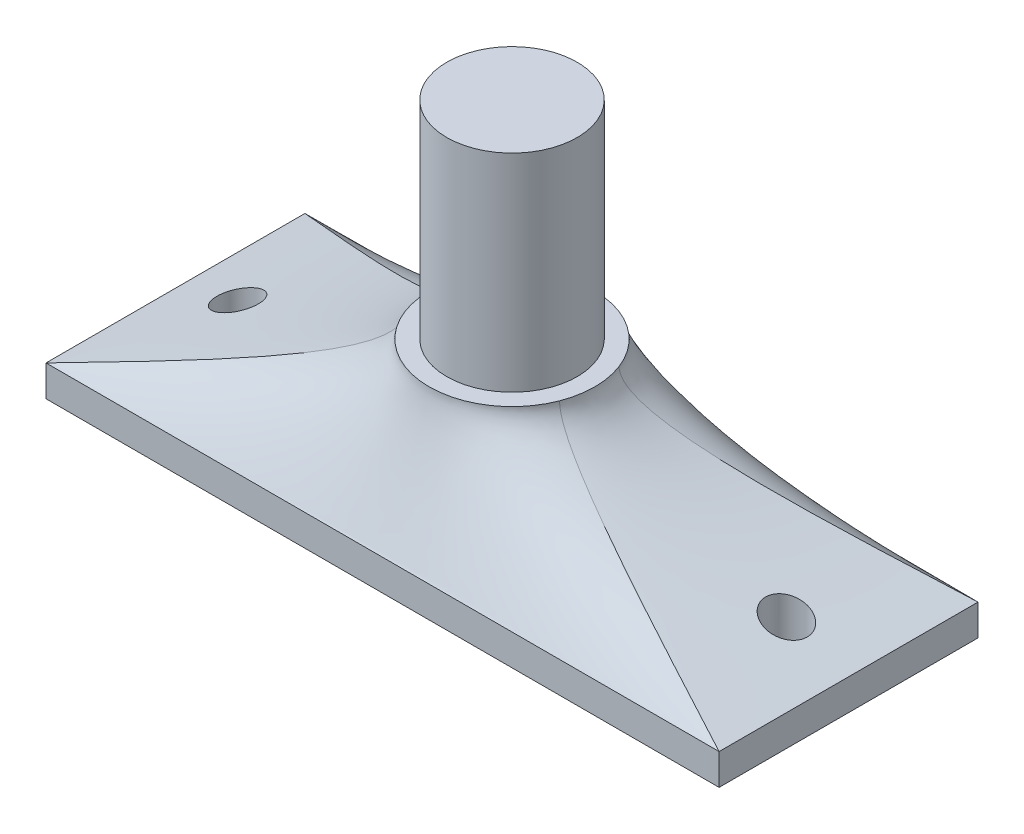
ISO-10303-21;
HEADER;
FILE_DESCRIPTION(('STEP AP214'),'2;1');
FILE_NAME('part.step','',(''),(''),'','','');
FILE_SCHEMA(('AUTOMOTIVE_DESIGN { 1 0 10303 214 1 1 1 1 }'));
ENDSEC;
DATA;
#1=APPLICATION_CONTEXT('core data for automotive mechanical design processes');
#2=APPLICATION_PROTOCOL_DEFINITION('international standard','automotive_design',2000,#1);
#3=PRODUCT_CONTEXT('',#1,'mechanical');
#4=PRODUCT('Part','Part','',(#3));
#5=PRODUCT_RELATED_PRODUCT_CATEGORY('part','',(#4));
#6=PRODUCT_DEFINITION_FORMATION('','',#4);
#7=PRODUCT_DEFINITION_CONTEXT('part definition',#1,'design');
#8=PRODUCT_DEFINITION('design','',#6,#7);
#9=PRODUCT_DEFINITION_SHAPE('','',#8);
#10=(LENGTH_UNIT() NAMED_UNIT(*) SI_UNIT(.MILLI.,.METRE.));
#11=(NAMED_UNIT(*) PLANE_ANGLE_UNIT() SI_UNIT($,.RADIAN.));
#12=(NAMED_UNIT(*) SI_UNIT($,.STERADIAN.) SOLID_ANGLE_UNIT());
#13=UNCERTAINTY_MEASURE_WITH_UNIT(LENGTH_MEASURE(1.E-05),#10,'distance_accuracy_value','');
#14=(GEOMETRIC_REPRESENTATION_CONTEXT(3) GLOBAL_UNCERTAINTY_ASSIGNED_CONTEXT((#13)) GLOBAL_UNIT_ASSIGNED_CONTEXT((#10,
#11,#12)) REPRESENTATION_CONTEXT('',''));
#15=CARTESIAN_POINT('',(0.,0.,0.));
#16=DIRECTION('',(0.,0.,1.));
#17=DIRECTION('',(1.,0.,0.));
#18=AXIS2_PLACEMENT_3D('',#15,#16,#17);
#19=CARTESIAN_POINT('',(-32.5,3.,-12.5));
#20=DIRECTION('',(1.,0.,0.));
#21=DIRECTION('',(0.,0.,-1.));
#22=AXIS2_PLACEMENT_3D('',#19,#20,#21);
#23=PLANE('',#22);
#24=DIRECTION('',(0.,0.,1.));
#25=VECTOR('',#24,1.);
#26=CARTESIAN_POINT('',(-32.5,0.,-12.5));
#27=LINE('',#26,#25);
#28=CARTESIAN_POINT('',(-32.5,0.,-12.5));
#29=VERTEX_POINT('',#28);
#30=CARTESIAN_POINT('',(-32.5,0.,12.5));
#31=VERTEX_POINT('',#30);
#32=EDGE_CURVE('E170',#29,#31,#27,.T.);
#33=ORIENTED_EDGE('',*,*,#32,.T.);
#34=DIRECTION('',(0.,-1.,0.));
#35=VECTOR('',#34,1.);
#36=CARTESIAN_POINT('',(-32.5,3.,12.5));
#37=LINE('',#36,#35);
#38=CARTESIAN_POINT('',(-32.5,3.,12.5));
#39=VERTEX_POINT('',#38);
#40=EDGE_CURVE('E116',#39,#31,#37,.T.);
#41=ORIENTED_EDGE('',*,*,#40,.F.);
#42=DIRECTION('',(0.,0.,-1.));
#43=VECTOR('',#42,1.);
#44=CARTESIAN_POINT('',(-32.5,3.,-12.5));
#45=LINE('',#44,#43);
#46=CARTESIAN_POINT('',(-32.5,3.,-12.5));
#47=VERTEX_POINT('',#46);
#48=EDGE_CURVE('E336',#47,#39,#45,.F.);
#49=ORIENTED_EDGE('',*,*,#48,.F.);
#50=DIRECTION('',(0.,-1.,0.));
#51=VECTOR('',#50,1.);
#52=CARTESIAN_POINT('',(-32.5,3.,-12.5));
#53=LINE('',#52,#51);
#54=EDGE_CURVE('E124',#47,#29,#53,.T.);
#55=ORIENTED_EDGE('',*,*,#54,.T.);
#56=EDGE_LOOP('',(#33,#41,#49,#55));
#57=FACE_BOUND('',#56,.T.);
#58=ADVANCED_FACE('F103',(#57),#23,.F.);
#59=CARTESIAN_POINT('',(-32.5,3.,12.5));
#60=DIRECTION('',(0.,0.,-1.));
#61=DIRECTION('',(-1.,0.,0.));
#62=AXIS2_PLACEMENT_3D('',#59,#60,#61);
#63=PLANE('',#62);
#64=DIRECTION('',(1.,0.,0.));
#65=VECTOR('',#64,1.);
#66=CARTESIAN_POINT('',(-32.5,0.,12.5));
#67=LINE('',#66,#65);
#68=CARTESIAN_POINT('',(32.5,0.,12.5));
#69=VERTEX_POINT('',#68);
#70=EDGE_CURVE('E323',#31,#69,#67,.T.);
#71=ORIENTED_EDGE('',*,*,#70,.T.);
#72=DIRECTION('',(0.,-1.,0.));
#73=VECTOR('',#72,1.);
#74=CARTESIAN_POINT('',(32.5,3.,12.5));
#75=LINE('',#74,#73);
#76=CARTESIAN_POINT('',(32.5,3.,12.5));
#77=VERTEX_POINT('',#76);
#78=EDGE_CURVE('E325',#77,#69,#75,.T.);
#79=ORIENTED_EDGE('',*,*,#78,.F.);
#80=DIRECTION('',(-1.,0.,0.));
#81=VECTOR('',#80,1.);
#82=CARTESIAN_POINT('',(-32.5,3.,12.5));
#83=LINE('',#82,#81);
#84=EDGE_CURVE('E167',#39,#77,#83,.F.);
#85=ORIENTED_EDGE('',*,*,#84,.F.);
#86=ORIENTED_EDGE('',*,*,#40,.T.);
#87=EDGE_LOOP('',(#71,#79,#85,#86));
#88=FACE_BOUND('',#87,.T.);
#89=ADVANCED_FACE('F313',(#88),#63,.F.);
#90=CARTESIAN_POINT('',(32.5,3.,-12.5));
#91=DIRECTION('',(1.,0.,0.));
#92=DIRECTION('',(0.,0.,-1.));
#93=AXIS2_PLACEMENT_3D('',#90,#91,#92);
#94=PLANE('',#93);
#95=DIRECTION('',(0.,0.,1.));
#96=VECTOR('',#95,1.);
#97=CARTESIAN_POINT('',(32.5,0.,-12.5));
#98=LINE('',#97,#96);
#99=CARTESIAN_POINT('',(32.5,0.,-12.5));
#100=VERTEX_POINT('',#99);
#101=EDGE_CURVE('E331',#100,#69,#98,.T.);
#102=ORIENTED_EDGE('',*,*,#101,.F.);
#103=DIRECTION('',(0.,-1.,0.));
#104=VECTOR('',#103,1.);
#105=CARTESIAN_POINT('',(32.5,3.,-12.5));
#106=LINE('',#105,#104);
#107=CARTESIAN_POINT('',(32.5,3.,-12.5));
#108=VERTEX_POINT('',#107);
#109=EDGE_CURVE('E341',#108,#100,#106,.T.);
#110=ORIENTED_EDGE('',*,*,#109,.F.);
#111=DIRECTION('',(0.,0.,-1.));
#112=VECTOR('',#111,1.);
#113=CARTESIAN_POINT('',(32.5,3.,-12.5));
#114=LINE('',#113,#112);
#115=EDGE_CURVE('E345',#108,#77,#114,.F.);
#116=ORIENTED_EDGE('',*,*,#115,.T.);
#117=ORIENTED_EDGE('',*,*,#78,.T.);
#118=EDGE_LOOP('',(#102,#110,#116,#117));
#119=FACE_BOUND('',#118,.T.);
#120=ADVANCED_FACE('F311',(#119),#94,.T.);
#121=CARTESIAN_POINT('',(-32.5,3.,-12.5));
#122=DIRECTION('',(0.,0.,-1.));
#123=DIRECTION('',(-1.,0.,0.));
#124=AXIS2_PLACEMENT_3D('',#121,#122,#123);
#125=PLANE('',#124);
#126=DIRECTION('',(1.,0.,0.));
#127=VECTOR('',#126,1.);
#128=CARTESIAN_POINT('',(-32.5,0.,-12.5));
#129=LINE('',#128,#127);
#130=EDGE_CURVE('E334',#29,#100,#129,.T.);
#131=ORIENTED_EDGE('',*,*,#130,.F.);
#132=ORIENTED_EDGE('',*,*,#54,.F.);
#133=DIRECTION('',(-1.,0.,0.));
#134=VECTOR('',#133,1.);
#135=CARTESIAN_POINT('',(-32.5,3.,-12.5));
#136=LINE('',#135,#134);
#137=EDGE_CURVE('E255',#47,#108,#136,.F.);
#138=ORIENTED_EDGE('',*,*,#137,.T.);
#139=ORIENTED_EDGE('',*,*,#109,.T.);
#140=EDGE_LOOP('',(#131,#132,#138,#139));
#141=FACE_BOUND('',#140,.T.);
#142=ADVANCED_FACE('F307',(#141),#125,.T.);
#143=CARTESIAN_POINT('',(0.,0.,0.));
#144=DIRECTION('',(0.,1.,0.));
#145=DIRECTION('',(0.,0.,1.));
#146=AXIS2_PLACEMENT_3D('',#143,#144,#145);
#147=PLANE('',#146);
#148=CARTESIAN_POINT('',(26.5,0.,0.));
#149=DIRECTION('',(0.,-1.,0.));
#150=DIRECTION('',(0.,0.,-1.));
#151=AXIS2_PLACEMENT_3D('',#148,#149,#150);
#152=CIRCLE('',#151,2.);
#153=CARTESIAN_POINT('',(26.5,0.,-2.));
#154=VERTEX_POINT('',#153);
#155=EDGE_CURVE('E353',#154,#154,#152,.T.);
#156=ORIENTED_EDGE('',*,*,#155,.F.);
#157=EDGE_LOOP('',(#156));
#158=FACE_BOUND('',#157,.T.);
#159=CARTESIAN_POINT('',(-26.5,0.,0.));
#160=DIRECTION('',(0.,-1.,0.));
#161=DIRECTION('',(0.,0.,-1.));
#162=AXIS2_PLACEMENT_3D('',#159,#160,#161);
#163=CIRCLE('',#162,2.);
#164=CARTESIAN_POINT('',(-26.5,0.,-2.));
#165=VERTEX_POINT('',#164);
#166=EDGE_CURVE('E373',#165,#165,#163,.T.);
#167=ORIENTED_EDGE('',*,*,#166,.F.);
#168=EDGE_LOOP('',(#167));
#169=FACE_BOUND('',#168,.T.);
#170=ORIENTED_EDGE('',*,*,#32,.F.);
#171=ORIENTED_EDGE('',*,*,#130,.T.);
#172=ORIENTED_EDGE('',*,*,#101,.T.);
#173=ORIENTED_EDGE('',*,*,#70,.F.);
#174=EDGE_LOOP('',(#170,#171,#172,#173));
#175=FACE_BOUND('',#174,.T.);
#176=ADVANCED_FACE('F212',(#158,#169,#175),#147,.F.);
#177=CARTESIAN_POINT('',(0.,15.,0.));
#178=DIRECTION('',(0.,1.,0.));
#179=DIRECTION('',(0.,0.,1.));
#180=AXIS2_PLACEMENT_3D('',#177,#178,#179);
#181=PLANE('',#180);
#182=CARTESIAN_POINT('',(0.,15.,0.));
#183=DIRECTION('',(0.,1.,0.));
#184=DIRECTION('',(0.,0.,1.));
#185=AXIS2_PLACEMENT_3D('',#182,#183,#184);
#186=CIRCLE('',#185,6.3);
#187=CARTESIAN_POINT('',(0.,15.,6.3));
#188=VERTEX_POINT('',#187);
#189=EDGE_CURVE('E12',#188,#188,#186,.T.);
#190=ORIENTED_EDGE('',*,*,#189,.F.);
#191=EDGE_LOOP('',(#190));
#192=FACE_BOUND('',#191,.T.);
#193=CARTESIAN_POINT('',(0.,15.,0.));
#194=DIRECTION('',(0.,1.,0.));
#195=DIRECTION('',(0.,0.,1.));
#196=AXIS2_PLACEMENT_3D('',#193,#194,#195);
#197=CIRCLE('',#196,8.);
#198=CARTESIAN_POINT('',(7.46676484962448,15.,2.87183263447095));
#199=VERTEX_POINT('',#198);
#200=CARTESIAN_POINT('',(7.46676484962448,15.,-2.87183263447095));
#201=VERTEX_POINT('',#200);
#202=EDGE_CURVE('E174',#199,#201,#197,.T.);
#203=ORIENTED_EDGE('',*,*,#202,.T.);
#204=CARTESIAN_POINT('',(-7.46676484962448,15.,-2.87183263447095));
#205=VERTEX_POINT('',#204);
#206=EDGE_CURVE('E182',#201,#205,#197,.T.);
#207=ORIENTED_EDGE('',*,*,#206,.T.);
#208=CARTESIAN_POINT('',(-7.46676484962448,15.,2.87183263447095));
#209=VERTEX_POINT('',#208);
#210=EDGE_CURVE('E189',#205,#209,#197,.T.);
#211=ORIENTED_EDGE('',*,*,#210,.T.);
#212=EDGE_CURVE('E163',#209,#199,#197,.T.);
#213=ORIENTED_EDGE('',*,*,#212,.T.);
#214=EDGE_LOOP('',(#203,#207,#211,#213));
#215=FACE_BOUND('',#214,.T.);
#216=ADVANCED_FACE('F187',(#192,#215),#181,.T.);
#217=CARTESIAN_POINT('',(32.5,3.,-12.5));
#218=CARTESIAN_POINT('',(19.9833824248122,7.04112904524328,-7.68591631723548));
#219=CARTESIAN_POINT('',(7.46676484962448,11.0822580904866,-2.87183263447095));
#220=CARTESIAN_POINT('',(7.46676484962448,15.,-2.87183263447095));
#221=CARTESIAN_POINT('',(29.7916666666667,3.,-12.5));
#222=CARTESIAN_POINT('',(18.4807158507022,7.18842026121634,-8.07201607658824));
#223=CARTESIAN_POINT('',(7.16976503473774,11.3768405224327,-3.64403215317647));
#224=CARTESIAN_POINT('',(7.16976503473774,15.,-3.64403215317647));
#225=CARTESIAN_POINT('',(24.375,3.,-12.5));
#226=CARTESIAN_POINT('',(15.364254186739,7.48300269316248,-8.77811919326923));
#227=CARTESIAN_POINT('',(6.353508373478,11.966005386325,-5.05623838653845));
#228=CARTESIAN_POINT('',(6.353508373478,15.,-5.05623838653845));
#229=CARTESIAN_POINT('',(17.6041666666667,3.,-12.5));
#230=CARTESIAN_POINT('',(11.2458859532579,7.77240435397408,-9.45989394786592));
#231=CARTESIAN_POINT('',(4.88760523984905,12.5448087079482,-6.41978789573184));
#232=CARTESIAN_POINT('',(4.88760523984905,15.,-6.41978789573184));
#233=CARTESIAN_POINT('',(12.1875,3.,-12.5));
#234=CARTESIAN_POINT('',(7.85195555015001,7.95626938495388,-9.85868423490611));
#235=CARTESIAN_POINT('',(3.51641110030003,12.9125387699078,-7.21736846981222));
#236=CARTESIAN_POINT('',(3.51641110030003,15.,-7.21736846981222));
#237=CARTESIAN_POINT('',(6.77083333333334,3.,-12.5));
#238=CARTESIAN_POINT('',(4.40602401701625,8.09794849467516,-10.154577959537));
#239=CARTESIAN_POINT('',(2.04121470069916,13.1958969893503,-7.80915591907407));
#240=CARTESIAN_POINT('',(2.04121470069916,15.,-7.80915591907407));
#241=CARTESIAN_POINT('',(0.,3.,-12.5));
#242=CARTESIAN_POINT('',(-0.000103206664410298,8.17738297070546,-10.3138868116123));
#243=CARTESIAN_POINT('',(-0.000206413328823415,13.3547659414109,-8.12777362322461));
#244=CARTESIAN_POINT('',(-0.000206413328823415,15.,-8.12777362322461));
#245=CARTESIAN_POINT('',(-6.77083333333333,3.,-12.5));
#246=CARTESIAN_POINT('',(-4.40582270670617,8.09794043096333,-10.1546098489905));
#247=CARTESIAN_POINT('',(-2.04081208007901,13.1958808619267,-7.80921969798104));
#248=CARTESIAN_POINT('',(-2.04081208007901,15.,-7.80921969798104));
#249=CARTESIAN_POINT('',(-12.1875,3.,-12.5));
#250=CARTESIAN_POINT('',(-7.85198810309784,7.95627103363079,-9.85868567750132));
#251=CARTESIAN_POINT('',(-3.51647620619567,12.9125420672616,-7.21737135500265));
#252=CARTESIAN_POINT('',(-3.51647620619567,15.,-7.21737135500265));
#253=CARTESIAN_POINT('',(-17.6041666666667,3.,-12.5));
#254=CARTESIAN_POINT('',(-11.2458045858882,7.77239987557378,-9.45993740314716));
#255=CARTESIAN_POINT('',(-4.88744250510964,12.5447997511476,-6.41987480629432));
#256=CARTESIAN_POINT('',(-4.88744250510964,15.,-6.41987480629432));
#257=CARTESIAN_POINT('',(-24.375,3.,-12.5));
#258=CARTESIAN_POINT('',(-15.3643029021089,7.48300545386905,-8.77809288559742));
#259=CARTESIAN_POINT('',(-6.3536058042179,11.9660109077381,-5.05618577119483));
#260=CARTESIAN_POINT('',(-6.3536058042179,15.,-5.05618577119483));
#261=CARTESIAN_POINT('',(-29.7916666666667,3.,-12.5));
#262=CARTESIAN_POINT('',(-18.4807158507022,7.18842118145187,-8.07201607658824));
#263=CARTESIAN_POINT('',(-7.16976503473774,11.3768423629037,-3.64403215317647));
#264=CARTESIAN_POINT('',(-7.16976503473774,15.,-3.64403215317647));
#265=CARTESIAN_POINT('',(-32.5,3.,-12.5));
#266=CARTESIAN_POINT('',(-19.9833824248122,7.04112904524328,-7.68591631723548));
#267=CARTESIAN_POINT('',(-7.46676484962448,11.0822580904866,-2.87183263447095));
#268=CARTESIAN_POINT('',(-7.46676484962448,15.,-2.87183263447095));
#269=B_SPLINE_SURFACE_WITH_KNOTS('',3,3,((#217,#218,#219,#220),(#221,#222,#223,#224),(#225,#226,
#227,#228),(#229,#230,#231,#232),(#233,#234,#235,#236),(#237,#238,#239,#240),(#241,#242,#243,
#244),(#245,#246,#247,#248),(#249,#250,#251,#252),(#253,#254,#255,#256),(#257,#258,#259,#260),
(#261,#262,#263,#264),(#265,#266,#267,#268)),.UNSPECIFIED.,.F.,.F.,.F.,(4,1,1,1,1,1,1,1,1,1,4),
(4,4),(0.,0.125,0.25,0.3125,0.375,0.5,0.625,0.6875,0.75,0.875,1.),(0.,1.),.UNSPECIFIED.);
#270=CARTESIAN_POINT('',(-32.5,3.,-12.5));
#271=CARTESIAN_POINT('',(-19.9833824248122,7.04112904524328,-7.68591631723548));
#272=CARTESIAN_POINT('',(-7.46676484962448,11.0822580904866,-2.87183263447095));
#273=CARTESIAN_POINT('',(-7.46676484962448,15.,-2.87183263447095));
#274=B_SPLINE_CURVE_WITH_KNOTS('',3,(#270,#271,#272,#273),.UNSPECIFIED.,.F.,.F.,(4,4),(0.,1.),.UNSPECIFIED.);
#275=EDGE_CURVE('E253',#47,#205,#274,.T.);
#276=CARTESIAN_POINT('',(32.5,3.,-12.5));
#277=CARTESIAN_POINT('',(19.9833824248122,7.04112904524328,-7.68591631723548));
#278=CARTESIAN_POINT('',(7.46676484962448,11.0822580904866,-2.87183263447095));
#279=CARTESIAN_POINT('',(7.46676484962448,15.,-2.87183263447095));
#280=B_SPLINE_CURVE_WITH_KNOTS('',3,(#276,#277,#278,#279),.UNSPECIFIED.,.F.,.F.,(4,4),(0.,1.),.UNSPECIFIED.);
#281=EDGE_CURVE('E178',#201,#108,#280,.F.);
#282=ORIENTED_EDGE('',*,*,#137,.F.);
#283=ORIENTED_EDGE('',*,*,#275,.T.);
#284=ORIENTED_EDGE('',*,*,#206,.F.);
#285=ORIENTED_EDGE('',*,*,#281,.T.);
#286=EDGE_LOOP('',(#282,#283,#284,#285));
#287=FACE_BOUND('',#286,.T.);
#288=ADVANCED_FACE('F211',(#287),#269,.T.);
#289=CARTESIAN_POINT('',(-32.5,3.,-12.5));
#290=CARTESIAN_POINT('',(-19.9833824248122,7.04112904524328,-7.68591631723548));
#291=CARTESIAN_POINT('',(-7.46676484962448,11.0822580904866,-2.87183263447095));
#292=CARTESIAN_POINT('',(-7.46676484962448,15.,-2.87183263447095));
#293=CARTESIAN_POINT('',(-32.5,3.,-4.16666666666667));
#294=CARTESIAN_POINT('',(-20.3388593936854,7.04112904524328,-2.59500953149872));
#295=CARTESIAN_POINT('',(-8.1777187873707,11.0822580904866,-1.02335239633076));
#296=CARTESIAN_POINT('',(-8.1777187873707,15.,-1.02335239633076));
#297=CARTESIAN_POINT('',(-32.5,3.,4.16666666666667));
#298=CARTESIAN_POINT('',(-20.3388593936854,7.04112904524328,2.59500953149871));
#299=CARTESIAN_POINT('',(-8.17771878737071,11.0822580904866,1.02335239633076));
#300=CARTESIAN_POINT('',(-8.17771878737071,15.,1.02335239633076));
#301=CARTESIAN_POINT('',(-32.5,3.,12.5));
#302=CARTESIAN_POINT('',(-19.9833824248122,7.04112904524328,7.68591631723547));
#303=CARTESIAN_POINT('',(-7.46676484962448,11.0822580904866,2.87183263447095));
#304=CARTESIAN_POINT('',(-7.46676484962448,15.,2.87183263447095));
#305=B_SPLINE_SURFACE_WITH_KNOTS('',3,3,((#289,#290,#291,#292),(#293,#294,#295,#296),(#297,#298,
#299,#300),(#301,#302,#303,#304)),.UNSPECIFIED.,.F.,.F.,.F.,(4,4),(4,4),(0.,1.),(0.,1.),.UNSPECIFIED.);
#306=CARTESIAN_POINT('',(-26.5,4.99513354081662,-2.));
#307=CARTESIAN_POINT('',(-26.558544197348,4.97532345201228,-2.00000088727221));
#308=CARTESIAN_POINT('',(-26.6170857393483,4.95553438552465,-1.99742900351758));
#309=CARTESIAN_POINT('',(-26.7337794024721,4.91612545272333,-1.98715298864062));
#310=CARTESIAN_POINT('',(-26.7919315186847,4.89650558854247,-1.97944879291973));
#311=CARTESIAN_POINT('',(-26.9074793303804,4.85755572094053,-1.95892961254703));
#312=CARTESIAN_POINT('',(-26.9648744274761,4.83822594533095,-1.94611080904403));
#313=CARTESIAN_POINT('',(-27.0784946692673,4.79999185118214,-1.9154149178711));
#314=CARTESIAN_POINT('',(-27.1347185453946,4.78108799231942,-1.89753262350826));
#315=CARTESIAN_POINT('',(-27.3009459670732,4.72524055059644,-1.83641005138759));
#316=CARTESIAN_POINT('',(-27.4085821425345,4.68913521271866,-1.78568046884016));
#317=CARTESIAN_POINT('',(-27.6139264573623,4.62033823696095,-1.66532793036907));
#318=CARTESIAN_POINT('',(-27.7116379429367,4.58764544840254,-1.59571137163328));
#319=CARTESIAN_POINT('',(-27.8469478457453,4.54241515552694,-1.47957791836871));
#320=CARTESIAN_POINT('',(-27.8896582537996,4.52814551420495,-1.43954551296626));
#321=CARTESIAN_POINT('',(-27.9715569409685,4.50079426803308,-1.35570896918131));
#322=CARTESIAN_POINT('',(-28.0107484620312,4.48771156953489,-1.31190837683076));
#323=CARTESIAN_POINT('',(-28.0852859994133,4.46283867279171,-1.22079188446663));
#324=CARTESIAN_POINT('',(-28.1206313856344,4.45104868632469,-1.17347541058913));
#325=CARTESIAN_POINT('',(-28.187132064096,4.42887302133144,-1.07568020042494));
#326=CARTESIAN_POINT('',(-28.2182866403062,4.41848758278083,-1.02520092590489));
#327=CARTESIAN_POINT('',(-28.301973103493,4.39059732312947,-0.874948716496666));
#328=CARTESIAN_POINT('',(-28.348697105371,4.37503464192636,-0.771475188222951));
#329=CARTESIAN_POINT('',(-28.4240682890387,4.34993646961286,-0.557524914076843));
#330=CARTESIAN_POINT('',(-28.4527211418393,4.34039908766721,-0.447050377219496));
#331=CARTESIAN_POINT('',(-28.4899791672795,4.32799838823413,-0.22759129206133));
#332=CARTESIAN_POINT('',(-28.4994371852902,4.32485114741239,-0.118767656486908));
#333=CARTESIAN_POINT('',(-28.5005138008223,4.32449286551262,0.0989659093081894));
#334=CARTESIAN_POINT('',(-28.4921350286313,4.32728094918682,0.207875824438261));
#335=CARTESIAN_POINT('',(-28.4581910059208,4.33857845338084,0.420557367852147));
#336=CARTESIAN_POINT('',(-28.4329515394543,4.34697942160118,0.524387085901946));
#337=CARTESIAN_POINT('',(-28.3665252562117,4.36909729144351,0.726203206460491));
#338=CARTESIAN_POINT('',(-28.3253378770641,4.38281438052797,0.824189402768419));
#339=CARTESIAN_POINT('',(-28.2277067665432,4.41534605455081,1.01316635217295));
#340=CARTESIAN_POINT('',(-28.171048575106,4.43423230503996,1.10403373645239));
#341=CARTESIAN_POINT('',(-28.0446029268113,4.47641009607152,1.27495458218225));
#342=CARTESIAN_POINT('',(-27.974813279133,4.49970237170809,1.35500623532761));
#343=CARTESIAN_POINT('',(-27.8211184039127,4.55104228407612,1.50555040635002));
#344=CARTESIAN_POINT('',(-27.7367541857705,4.5792449118903,1.57552108662131));
#345=CARTESIAN_POINT('',(-27.558552649835,4.63888283539229,1.70038589222936));
#346=CARTESIAN_POINT('',(-27.4647131133814,4.67031888822385,1.75527647529075));
#347=CARTESIAN_POINT('',(-27.2651631278244,4.73725576933617,1.85132271536202));
#348=CARTESIAN_POINT('',(-27.1590922484416,4.77288179698014,1.89164264149095));
#349=CARTESIAN_POINT('',(-26.9422183650329,4.84584098874001,1.95375914973748));
#350=CARTESIAN_POINT('',(-26.8314142808427,4.88317454266929,1.97555147969887));
#351=CARTESIAN_POINT('',(-26.6033794801167,4.96014797148875,2.00075023422957));
#352=CARTESIAN_POINT('',(-26.4860715544755,4.99981964182739,2.00336604334389));
#353=CARTESIAN_POINT('',(-26.2526981754031,5.07890951051158,1.9880946851346));
#354=CARTESIAN_POINT('',(-26.1366328977474,5.11832767269092,1.97020465489409));
#355=CARTESIAN_POINT('',(-25.9073636199755,5.19636799658931,1.913873101254));
#356=CARTESIAN_POINT('',(-25.7942233368674,5.23497100528223,1.87514438540142));
#357=CARTESIAN_POINT('',(-25.5759414326916,5.30962296968861,1.77774996319319));
#358=CARTESIAN_POINT('',(-25.4707993953921,5.3456720583024,1.71908529518254));
#359=CARTESIAN_POINT('',(-25.274017334105,5.4132956191299,1.58457250346424));
#360=CARTESIAN_POINT('',(-25.1821395596479,5.44494834825797,1.50911234974805));
#361=CARTESIAN_POINT('',(-25.0124834894192,5.50351657698765,1.34217861575911));
#362=CARTESIAN_POINT('',(-24.9347011165465,5.53043344637299,1.25070968112969));
#363=CARTESIAN_POINT('',(-24.7996226837953,5.57725788100032,1.05913741941982));
#364=CARTESIAN_POINT('',(-24.7415060785861,5.59744545441659,0.959681558152074));
#365=CARTESIAN_POINT('',(-24.6429449593924,5.63172284637509,0.751401640686857));
#366=CARTESIAN_POINT('',(-24.6024938277986,5.64581494830445,0.64258111087769));
#367=CARTESIAN_POINT('',(-24.5426174100543,5.66668784110143,0.425066674309876));
#368=CARTESIAN_POINT('',(-24.5221673569929,5.67382489668468,0.316688390922719));
#369=CARTESIAN_POINT('',(-24.499368205925,5.68178235641138,0.0978242457574597));
#370=CARTESIAN_POINT('',(-24.4970149999182,5.68260419411489,-0.0126611319993441));
#371=CARTESIAN_POINT('',(-24.5102811003559,5.67797337098905,-0.228850222818007));
#372=CARTESIAN_POINT('',(-24.525328293762,5.67272044389276,-0.334593888776174));
#373=CARTESIAN_POINT('',(-24.5718857293934,5.6564830555622,-0.541911455676614));
#374=CARTESIAN_POINT('',(-24.603395812208,5.64549864982598,-0.64348539698416));
#375=CARTESIAN_POINT('',(-24.6819979451602,5.61813624809813,-0.840327488172442));
#376=CARTESIAN_POINT('',(-24.729174293759,5.60172907509355,-0.935558102339939));
#377=CARTESIAN_POINT('',(-24.8103038692085,5.57356272328518,-1.07131604970272));
#378=CARTESIAN_POINT('',(-24.8390833432496,5.56357830208145,-1.11539783944757));
#379=CARTESIAN_POINT('',(-24.8999054252507,5.54249602595863,-1.20102305243099));
#380=CARTESIAN_POINT('',(-24.931950585007,5.53139730042758,-1.2425644494282));
#381=CARTESIAN_POINT('',(-25.0351314475299,5.49569488686935,-1.36598946802446));
#382=CARTESIAN_POINT('',(-25.1112837879938,5.46939012338,-1.44327823848763));
#383=CARTESIAN_POINT('',(-25.2742838126317,5.41321118653084,-1.58405445498544));
#384=CARTESIAN_POINT('',(-25.3611356423406,5.38333562979567,-1.64753652508008));
#385=CARTESIAN_POINT('',(-25.5000442299842,5.33566092179451,-1.73299346806059));
#386=CARTESIAN_POINT('',(-25.549158026282,5.31882332500431,-1.76041029479));
#387=CARTESIAN_POINT('',(-25.6492881677172,5.28453533647488,-1.81092053314077));
#388=CARTESIAN_POINT('',(-25.7003027718443,5.2670855063152,-1.83401778986855));
#389=CARTESIAN_POINT('',(-25.8557091118099,5.21398887113623,-1.8966635305282));
#390=CARTESIAN_POINT('',(-25.9625871473534,5.1775524289442,-1.92964170525595));
#391=CARTESIAN_POINT('',(-26.1416447983074,5.11664220486075,-1.96896079239135));
#392=CARTESIAN_POINT('',(-26.2128351925619,5.09245883436013,-1.98058851632408));
#393=CARTESIAN_POINT('',(-26.3560183796022,5.04388423164117,-1.99610769500562));
#394=CARTESIAN_POINT('',(-26.428011197292,5.01949299297695,-1.99999890896679));
#395=CARTESIAN_POINT('',(-26.5,4.99513354081662,-2.));
#396=B_SPLINE_CURVE_WITH_KNOTS('',3,(#306,#307,#308,#309,#310,#311,#312,#313,#314,#315,#316,
#317,#318,#319,#320,#321,#322,#323,#324,#325,#326,#327,#328,#329,#330,#331,#332,#333,#334,#335,
#336,#337,#338,#339,#340,#341,#342,#343,#344,#345,#346,#347,#348,#349,#350,#351,#352,#353,#354,
#355,#356,#357,#358,#359,#360,#361,#362,#363,#364,#365,#366,#367,#368,#369,#370,#371,#372,#373,
#374,#375,#376,#377,#378,#379,#380,#381,#382,#383,#384,#385,#386,#387,#388,#389,#390,#391,#392,
#393,#394,#395),.UNSPECIFIED.,.T.,.F.,(4,2,2,2,2,2,2,2,2,2,2,2,2,2,2,2,2,2,2,2,2,2,2,2,2,2,2,2,
2,2,2,2,2,2,2,2,2,2,2,2,2,2,2,2,4),(0.,0.185345059764697,0.37069245244493,0.556178495574335,
0.74185596752436,1.11296742673735,1.48395334377078,1.66451838418619,1.8449153255904,
2.02534177642533,2.2057990153829,2.54768665508991,2.88946695162417,3.21569635259893,
3.54187764975529,3.861932015402,4.18199766815821,4.50674759551737,4.83155175149505,
5.16957899328436,5.50768556903053,5.86290391251624,6.21820375801951,6.5880737227294,
6.95799533301909,7.33315079543741,7.70828672123628,8.07552100088202,8.4426488877121,
8.79168827021267,9.14059678773923,9.47051061108623,9.80034954148998,10.1196446875776,
10.43893674198,10.7599754896729,10.9205778492853,11.0813066795694,11.4146760117865,
11.7481749171548,11.9241420203778,12.0999517313752,12.4511226894777,12.6790249289792,
12.9069342614958),.UNSPECIFIED.);
#397=CARTESIAN_POINT('',(-26.5,4.99513354081662,-2.));
#398=VERTEX_POINT('',#397);
#399=EDGE_CURVE('E106',#398,#398,#396,.T.);
#400=CARTESIAN_POINT('',(-32.5,3.,12.5));
#401=CARTESIAN_POINT('',(-19.9833824248122,7.04112904524328,7.68591631723547));
#402=CARTESIAN_POINT('',(-7.46676484962448,11.0822580904866,2.87183263447095));
#403=CARTESIAN_POINT('',(-7.46676484962448,15.,2.87183263447095));
#404=B_SPLINE_CURVE_WITH_KNOTS('',3,(#400,#401,#402,#403),.UNSPECIFIED.,.F.,.F.,(4,4),(0.,1.),.UNSPECIFIED.);
#405=EDGE_CURVE('E171',#39,#209,#404,.T.);
#406=ORIENTED_EDGE('',*,*,#399,.F.);
#407=EDGE_LOOP('',(#406));
#408=FACE_BOUND('',#407,.T.);
#409=ORIENTED_EDGE('',*,*,#48,.T.);
#410=ORIENTED_EDGE('',*,*,#405,.T.);
#411=ORIENTED_EDGE('',*,*,#210,.F.);
#412=ORIENTED_EDGE('',*,*,#275,.F.);
#413=EDGE_LOOP('',(#409,#410,#411,#412));
#414=FACE_BOUND('',#413,.T.);
#415=ADVANCED_FACE('F252',(#408,#414),#305,.T.);
#416=CARTESIAN_POINT('',(32.5,3.,12.5));
#417=CARTESIAN_POINT('',(19.9833824248122,7.04112904524328,7.68591631723548));
#418=CARTESIAN_POINT('',(7.46676484962448,11.0822580904866,2.87183263447095));
#419=CARTESIAN_POINT('',(7.46676484962448,15.,2.87183263447095));
#420=CARTESIAN_POINT('',(32.5,3.,4.16666666666667));
#421=CARTESIAN_POINT('',(20.3388593936854,7.04112904524328,2.59500953149871));
#422=CARTESIAN_POINT('',(8.1777187873707,11.0822580904866,1.02335239633076));
#423=CARTESIAN_POINT('',(8.1777187873707,15.,1.02335239633076));
#424=CARTESIAN_POINT('',(32.5,3.,-4.16666666666667));
#425=CARTESIAN_POINT('',(20.3388593936854,7.04112904524328,-2.59500953149872));
#426=CARTESIAN_POINT('',(8.17771878737071,11.0822580904866,-1.02335239633076));
#427=CARTESIAN_POINT('',(8.17771878737071,15.,-1.02335239633076));
#428=CARTESIAN_POINT('',(32.5,3.,-12.5));
#429=CARTESIAN_POINT('',(19.9833824248122,7.04112904524328,-7.68591631723548));
#430=CARTESIAN_POINT('',(7.46676484962448,11.0822580904866,-2.87183263447095));
#431=CARTESIAN_POINT('',(7.46676484962448,15.,-2.87183263447095));
#432=B_SPLINE_SURFACE_WITH_KNOTS('',3,3,((#416,#417,#418,#419),(#420,#421,#422,#423),(#424,#425,
#426,#427),(#428,#429,#430,#431)),.UNSPECIFIED.,.F.,.F.,.F.,(4,4),(4,4),(0.,1.),(0.,1.),.UNSPECIFIED.);
#433=CARTESIAN_POINT('',(26.5,4.99513354081662,-2.));
#434=CARTESIAN_POINT('',(26.4412825579066,5.0150022233974,-2.00000086308696));
#435=CARTESIAN_POINT('',(26.3825796098307,5.03488623644542,-1.99741373314148));
#436=CARTESIAN_POINT('',(26.2655899195309,5.07455555523809,-1.98708313847084));
#437=CARTESIAN_POINT('',(26.2073031872409,5.09434085862347,-1.97933955109047));
#438=CARTESIAN_POINT('',(26.0915109824816,5.13368988572596,-1.9587232254531));
#439=CARTESIAN_POINT('',(26.0340061678475,5.15325342081285,-1.94584641503054));
#440=CARTESIAN_POINT('',(25.92019318108,5.19201753555963,-1.91502149383328));
#441=CARTESIAN_POINT('',(25.8638862983876,5.21121772187998,-1.89706818903938));
#442=CARTESIAN_POINT('',(25.697461286122,5.26803390732005,-1.83572557505061));
#443=CARTESIAN_POINT('',(25.5897457280304,5.30489716150032,-1.78483701476823));
#444=CARTESIAN_POINT('',(25.3843033307942,5.37536825772338,-1.66415164736453));
#445=CARTESIAN_POINT('',(25.2865731800316,5.40897717885724,-1.59436113721153));
#446=CARTESIAN_POINT('',(25.1511790528862,5.45563923387979,-1.47787704940691));
#447=CARTESIAN_POINT('',(25.1083965070126,5.47040103235148,-1.43767226741122));
#448=CARTESIAN_POINT('',(25.0263739424515,5.49873143150037,-1.35346721912603));
#449=CARTESIAN_POINT('',(24.9871306668077,5.51230112888496,-1.30947051674909));
#450=CARTESIAN_POINT('',(24.9125125008167,5.53812766269732,-1.21793675394313));
#451=CARTESIAN_POINT('',(24.8771382111424,5.55038429526137,-1.17039914569711));
#452=CARTESIAN_POINT('',(24.810606426552,5.57345655092274,-1.07213611975289));
#453=CARTESIAN_POINT('',(24.7794496385632,5.58427193243639,-1.02141016971412));
#454=CARTESIAN_POINT('',(24.695924826856,5.61328774731372,-0.870627404577083));
#455=CARTESIAN_POINT('',(24.6493694394095,5.62949008250571,-0.766859714165326));
#456=CARTESIAN_POINT('',(24.5744097488176,5.65560014920805,-0.552290153709783));
#457=CARTESIAN_POINT('',(24.5459990426001,5.66551010122874,-0.441490780266091));
#458=CARTESIAN_POINT('',(24.5093971452059,5.67828090083422,-0.221935011242874));
#459=CARTESIAN_POINT('',(24.5002632087697,5.68147040353872,-0.113354922545655));
#460=CARTESIAN_POINT('',(24.4997481080724,5.68165020780971,0.103839918261877));
#461=CARTESIAN_POINT('',(24.5083640612436,5.67864151595795,0.212454661880139));
#462=CARTESIAN_POINT('',(24.5426342136524,5.66668398626472,0.424248134105603));
#463=CARTESIAN_POINT('',(24.5679252932765,5.65786174715477,0.527493195303302));
#464=CARTESIAN_POINT('',(24.6342592893635,5.63475119895055,0.728133363786489));
#465=CARTESIAN_POINT('',(24.6753029219722,5.62046264134552,0.82552820487526));
#466=CARTESIAN_POINT('',(24.7725522124161,5.58666172776531,1.01356668822317));
#467=CARTESIAN_POINT('',(24.8290022302898,5.5670652241453,1.10406853179751));
#468=CARTESIAN_POINT('',(24.9548978273546,5.52344507956637,1.27431351555926));
#469=CARTESIAN_POINT('',(25.0243458361604,5.49942061093474,1.35405463952426));
#470=CARTESIAN_POINT('',(25.1775794656395,5.44652351094087,1.50440655133936));
#471=CARTESIAN_POINT('',(25.2618718062777,5.41748064460844,1.57444062787521));
#472=CARTESIAN_POINT('',(25.4399448403119,5.35626620196656,1.69944899735212));
#473=CARTESIAN_POINT('',(25.5337279100853,5.32409384214391,1.75441950569728));
#474=CARTESIAN_POINT('',(25.7335003127457,5.25571753670575,1.85078992510304));
#475=CARTESIAN_POINT('',(25.8398743932667,5.21938994777885,1.89130518360612));
#476=CARTESIAN_POINT('',(26.0574621417203,5.14525194498083,1.95370889779638));
#477=CARTESIAN_POINT('',(26.1686769183033,5.10744119162281,1.97559306261154));
#478=CARTESIAN_POINT('',(26.3975297076123,5.02979983325972,2.00081779193688));
#479=CARTESIAN_POINT('',(26.5152468992684,4.98994885289359,2.00338318749954));
#480=CARTESIAN_POINT('',(26.749510691423,4.91079746774447,1.98784512203419));
#481=CARTESIAN_POINT('',(26.8660571529738,4.87149712810052,1.96973923621128));
#482=CARTESIAN_POINT('',(27.0958091996989,4.7941524277098,1.91289059501945));
#483=CARTESIAN_POINT('',(27.2089707102954,4.75612420070132,1.87394682958688));
#484=CARTESIAN_POINT('',(27.4272921961584,4.6828591036394,1.77607285553631));
#485=CARTESIAN_POINT('',(27.5324528565793,4.6476219945574,1.71714436067829));
#486=CARTESIAN_POINT('',(27.7288378328182,4.58189053919058,1.58233641218089));
#487=CARTESIAN_POINT('',(27.8203435016423,4.55130010391648,1.50691452000781));
#488=CARTESIAN_POINT('',(27.9892848037706,4.49486942942754,1.34018730327963));
#489=CARTESIAN_POINT('',(28.0667245081288,4.46902781575545,1.24888658948942));
#490=CARTESIAN_POINT('',(28.2012261256163,4.42417092742272,1.05774132407894));
#491=CARTESIAN_POINT('',(28.2590973722437,4.40488429755939,0.958530207209728));
#492=CARTESIAN_POINT('',(28.3572490704749,4.37218531304331,0.750866883699932));
#493=CARTESIAN_POINT('',(28.3975354296657,4.35877098560486,0.642417795182154));
#494=CARTESIAN_POINT('',(28.4573557093689,4.33885595236566,0.425218403995615));
#495=CARTESIAN_POINT('',(28.4778262077683,4.33204321063728,0.316754066102217));
#496=CARTESIAN_POINT('',(28.5006406914143,4.3244505184377,0.0977349379853891));
#497=CARTESIAN_POINT('',(28.5029883209015,4.32366935510538,-0.0128194274820568));
#498=CARTESIAN_POINT('',(28.4896623109556,4.32810410440476,-0.229565502260371));
#499=CARTESIAN_POINT('',(28.4744955949462,4.33315132417834,-0.335792259279622));
#500=CARTESIAN_POINT('',(28.427537490266,4.34878235292343,-0.544058751847127));
#501=CARTESIAN_POINT('',(28.3957463055014,4.35936609398719,-0.646098538733779));
#502=CARTESIAN_POINT('',(28.316437307381,4.38578016946907,-0.843764869957649));
#503=CARTESIAN_POINT('',(28.2688442179577,4.40163561741132,-0.939358029974554));
#504=CARTESIAN_POINT('',(28.1869830354865,4.42892310958096,-1.07559623281741));
#505=CARTESIAN_POINT('',(28.1579420959002,4.43860586960175,-1.11982726668963));
#506=CARTESIAN_POINT('',(28.0965636349248,4.45907695860653,-1.20572480720182));
#507=CARTESIAN_POINT('',(28.0642235084425,4.46986616129202,-1.24738924492696));
#508=CARTESIAN_POINT('',(27.9603653632877,4.50452732384465,-1.37081481434628));
#509=CARTESIAN_POINT('',(27.8838328954107,4.5300853651992,-1.44797455494915));
#510=CARTESIAN_POINT('',(27.7200732522696,4.5848259191672,-1.58841685285182));
#511=CARTESIAN_POINT('',(27.6328421428042,4.61400976514587,-1.65169428122432));
#512=CARTESIAN_POINT('',(27.4935596428595,4.66066227302898,-1.73666493276069));
#513=CARTESIAN_POINT('',(27.4444436521629,4.6771230443755,-1.76384755840078));
#514=CARTESIAN_POINT('',(27.3443395380353,4.71069403854948,-1.8138968004109));
#515=CARTESIAN_POINT('',(27.2933531279361,4.72780366747631,-1.83676725441628));
#516=CARTESIAN_POINT('',(27.1380823959993,4.77994568445303,-1.89874649356701));
#517=CARTESIAN_POINT('',(27.0313613542535,4.81583312587328,-1.93129910593072));
#518=CARTESIAN_POINT('',(26.8534297606371,4.87576692270136,-1.96981580536106));
#519=CARTESIAN_POINT('',(26.7831806321485,4.8994541339629,-1.98112622103403));
#520=CARTESIAN_POINT('',(26.6419472923709,4.9471312744227,-1.99621789876767));
#521=CARTESIAN_POINT('',(26.5709630612257,4.97112121180182,-1.99999895691484));
#522=CARTESIAN_POINT('',(26.5,4.99513354081662,-2.));
#523=B_SPLINE_CURVE_WITH_KNOTS('',3,(#433,#434,#435,#436,#437,#438,#439,#440,#441,#442,#443,
#444,#445,#446,#447,#448,#449,#450,#451,#452,#453,#454,#455,#456,#457,#458,#459,#460,#461,#462,
#463,#464,#465,#466,#467,#468,#469,#470,#471,#472,#473,#474,#475,#476,#477,#478,#479,#480,#481,
#482,#483,#484,#485,#486,#487,#488,#489,#490,#491,#492,#493,#494,#495,#496,#497,#498,#499,#500,
#501,#502,#503,#504,#505,#506,#507,#508,#509,#510,#511,#512,#513,#514,#515,#516,#517,#518,#519,
#520,#521,#522),.UNSPECIFIED.,.T.,.F.,(4,2,2,2,2,2,2,2,2,2,2,2,2,2,2,2,2,2,2,2,2,2,2,2,2,2,2,2,
2,2,2,2,2,2,2,2,2,2,2,2,2,2,2,2,4),(0.,0.185894152149651,0.371792726269121,0.557839067402367,
0.744076455089174,1.11625603215078,1.48831177402931,1.66972689891699,1.85097333872059,
2.0322478778139,2.2135527641735,2.55627903699386,2.89888429830035,3.22430415524313,
3.54967116843208,3.86817711252979,4.18669753832374,4.5105973587358,4.83455778383142,
5.17318313848456,5.51189349209521,5.86874724218528,6.22568315599028,6.59686854390705,
6.96809747730616,7.34297374582736,7.71781787553101,8.08334825111286,8.44877266358748,
8.7963838759167,9.14387821931919,9.47400466364927,9.80406472270862,10.1248061917112,
10.4455437267769,10.7678316327685,10.9290566909741,11.0904100553026,11.4237622421604,
11.7572373819209,11.9325621783016,12.1077301994574,12.4576143936966,12.6822709928827,
12.9069336762385),.UNSPECIFIED.);
#524=CARTESIAN_POINT('',(26.5,4.99513354081662,-2.));
#525=VERTEX_POINT('',#524);
#526=EDGE_CURVE('E348',#525,#525,#523,.T.);
#527=CARTESIAN_POINT('',(32.5,3.,12.5));
#528=CARTESIAN_POINT('',(19.9833824248122,7.04112904524328,7.68591631723548));
#529=CARTESIAN_POINT('',(7.46676484962448,11.0822580904866,2.87183263447095));
#530=CARTESIAN_POINT('',(7.46676484962448,15.,2.87183263447095));
#531=B_SPLINE_CURVE_WITH_KNOTS('',3,(#527,#528,#529,#530),.UNSPECIFIED.,.F.,.F.,(4,4),(0.,1.),.UNSPECIFIED.);
#532=EDGE_CURVE('E158',#77,#199,#531,.T.);
#533=ORIENTED_EDGE('',*,*,#526,.F.);
#534=EDGE_LOOP('',(#533));
#535=FACE_BOUND('',#534,.T.);
#536=ORIENTED_EDGE('',*,*,#115,.F.);
#537=ORIENTED_EDGE('',*,*,#281,.F.);
#538=ORIENTED_EDGE('',*,*,#202,.F.);
#539=ORIENTED_EDGE('',*,*,#532,.F.);
#540=EDGE_LOOP('',(#536,#537,#538,#539));
#541=FACE_BOUND('',#540,.T.);
#542=ADVANCED_FACE('F176',(#535,#541),#432,.T.);
#543=CARTESIAN_POINT('',(-32.5,3.,12.5));
#544=CARTESIAN_POINT('',(-19.9833824248122,7.04112904524328,7.68591631723547));
#545=CARTESIAN_POINT('',(-7.46676484962448,11.0822580904866,2.87183263447095));
#546=CARTESIAN_POINT('',(-7.46676484962448,15.,2.87183263447095));
#547=CARTESIAN_POINT('',(-29.7916666666667,3.,12.5));
#548=CARTESIAN_POINT('',(-18.4807158507022,7.18842026121634,8.07201607658824));
#549=CARTESIAN_POINT('',(-7.16976503473774,11.3768405224327,3.64403215317647));
#550=CARTESIAN_POINT('',(-7.16976503473774,15.,3.64403215317647));
#551=CARTESIAN_POINT('',(-24.375,3.,12.5));
#552=CARTESIAN_POINT('',(-15.364254186739,7.48300269316248,8.77811919326923));
#553=CARTESIAN_POINT('',(-6.353508373478,11.966005386325,5.05623838653845));
#554=CARTESIAN_POINT('',(-6.353508373478,15.,5.05623838653845));
#555=CARTESIAN_POINT('',(-17.6041666666667,3.,12.5));
#556=CARTESIAN_POINT('',(-11.2458859532579,7.77240435397406,9.45989394786592));
#557=CARTESIAN_POINT('',(-4.88760523984904,12.5448087079481,6.41978789573184));
#558=CARTESIAN_POINT('',(-4.88760523984904,15.,6.41978789573184));
#559=CARTESIAN_POINT('',(-12.1875,3.,12.5));
#560=CARTESIAN_POINT('',(-7.85195555015001,7.95626938495389,9.85868423490611));
#561=CARTESIAN_POINT('',(-3.51641110030003,12.9125387699078,7.21736846981222));
#562=CARTESIAN_POINT('',(-3.51641110030003,15.,7.21736846981222));
#563=CARTESIAN_POINT('',(-6.77083333333334,3.,12.5));
#564=CARTESIAN_POINT('',(-4.40602401701625,8.09794849467514,10.154577959537));
#565=CARTESIAN_POINT('',(-2.04121470069917,13.1958969893503,7.80915591907406));
#566=CARTESIAN_POINT('',(-2.04121470069917,15.,7.80915591907406));
#567=CARTESIAN_POINT('',(0.,3.,12.5));
#568=CARTESIAN_POINT('',(0.000103206664411382,8.17738297070546,10.3138868116123));
#569=CARTESIAN_POINT('',(0.000206413328825584,13.3547659414109,8.12777362322462));
#570=CARTESIAN_POINT('',(0.000206413328825584,15.,8.12777362322462));
#571=CARTESIAN_POINT('',(6.77083333333333,3.,12.5));
#572=CARTESIAN_POINT('',(4.40582270670617,8.09794043096332,10.1546098489905));
#573=CARTESIAN_POINT('',(2.04081208007901,13.1958808619266,7.80921969798103));
#574=CARTESIAN_POINT('',(2.04081208007901,15.,7.80921969798103));
#575=CARTESIAN_POINT('',(12.1875,3.,12.5));
#576=CARTESIAN_POINT('',(7.85198810309784,7.95627103363079,9.85868567750133));
#577=CARTESIAN_POINT('',(3.51647620619567,12.9125420672616,7.21737135500266));
#578=CARTESIAN_POINT('',(3.51647620619567,15.,7.21737135500266));
#579=CARTESIAN_POINT('',(17.6041666666667,3.,12.5));
#580=CARTESIAN_POINT('',(11.2458045858881,7.77239987557378,9.45993740314716));
#581=CARTESIAN_POINT('',(4.88744250510963,12.5447997511476,6.41987480629431));
#582=CARTESIAN_POINT('',(4.88744250510963,15.,6.41987480629431));
#583=CARTESIAN_POINT('',(24.375,3.,12.5));
#584=CARTESIAN_POINT('',(15.364302902109,7.48300545386903,8.77809288559742));
#585=CARTESIAN_POINT('',(6.3536058042179,11.9660109077381,5.05618577119484));
#586=CARTESIAN_POINT('',(6.3536058042179,15.,5.05618577119484));
#587=CARTESIAN_POINT('',(29.7916666666667,3.,12.5));
#588=CARTESIAN_POINT('',(18.4807158507022,7.18842118145187,8.07201607658824));
#589=CARTESIAN_POINT('',(7.16976503473774,11.3768423629037,3.64403215317648));
#590=CARTESIAN_POINT('',(7.16976503473774,15.,3.64403215317648));
#591=CARTESIAN_POINT('',(32.5,3.,12.5));
#592=CARTESIAN_POINT('',(19.9833824248122,7.04112904524328,7.68591631723548));
#593=CARTESIAN_POINT('',(7.46676484962448,11.0822580904866,2.87183263447095));
#594=CARTESIAN_POINT('',(7.46676484962448,15.,2.87183263447095));
#595=B_SPLINE_SURFACE_WITH_KNOTS('',3,3,((#543,#544,#545,#546),(#547,#548,#549,#550),(#551,#552,
#553,#554),(#555,#556,#557,#558),(#559,#560,#561,#562),(#563,#564,#565,#566),(#567,#568,#569,
#570),(#571,#572,#573,#574),(#575,#576,#577,#578),(#579,#580,#581,#582),(#583,#584,#585,#586),
(#587,#588,#589,#590),(#591,#592,#593,#594)),.UNSPECIFIED.,.F.,.F.,.F.,(4,1,1,1,1,1,1,1,1,1,4),
(4,4),(0.,0.125,0.25,0.3125,0.375,0.5,0.625,0.6875,0.75,0.875,1.),(0.,1.),.UNSPECIFIED.);
#596=ORIENTED_EDGE('',*,*,#84,.T.);
#597=ORIENTED_EDGE('',*,*,#532,.T.);
#598=ORIENTED_EDGE('',*,*,#212,.F.);
#599=ORIENTED_EDGE('',*,*,#405,.F.);
#600=EDGE_LOOP('',(#596,#597,#598,#599));
#601=FACE_BOUND('',#600,.T.);
#602=ADVANCED_FACE('F160',(#601),#595,.T.);
#603=CARTESIAN_POINT('',(0.,35.,0.));
#604=DIRECTION('',(0.,-1.,0.));
#605=DIRECTION('',(0.,0.,-1.));
#606=AXIS2_PLACEMENT_3D('',#603,#604,#605);
#607=CYLINDRICAL_SURFACE('',#606,6.3);
#608=CARTESIAN_POINT('',(0.,35.,0.));
#609=DIRECTION('',(0.,1.,0.));
#610=DIRECTION('',(0.,0.,1.));
#611=AXIS2_PLACEMENT_3D('',#608,#609,#610);
#612=CIRCLE('',#611,6.3);
#613=CARTESIAN_POINT('',(0.,35.,6.3));
#614=VERTEX_POINT('',#613);
#615=EDGE_CURVE('E191',#614,#614,#612,.T.);
#616=ORIENTED_EDGE('',*,*,#615,.F.);
#617=EDGE_LOOP('',(#616));
#618=FACE_BOUND('',#617,.T.);
#619=ORIENTED_EDGE('',*,*,#189,.T.);
#620=EDGE_LOOP('',(#619));
#621=FACE_BOUND('',#620,.T.);
#622=ADVANCED_FACE('F214',(#618,#621),#607,.T.);
#623=CARTESIAN_POINT('',(0.,35.,0.));
#624=DIRECTION('',(0.,1.,0.));
#625=DIRECTION('',(0.,0.,1.));
#626=AXIS2_PLACEMENT_3D('',#623,#624,#625);
#627=PLANE('',#626);
#628=ORIENTED_EDGE('',*,*,#615,.T.);
#629=EDGE_LOOP('',(#628));
#630=FACE_BOUND('',#629,.T.);
#631=ADVANCED_FACE('F358',(#630),#627,.T.);
#632=CARTESIAN_POINT('',(26.5,35.,0.));
#633=DIRECTION('',(0.,-1.,0.));
#634=DIRECTION('',(0.,0.,-1.));
#635=AXIS2_PLACEMENT_3D('',#632,#633,#634);
#636=CYLINDRICAL_SURFACE('',#635,2.);
#637=ORIENTED_EDGE('',*,*,#526,.T.);
#638=EDGE_LOOP('',(#637));
#639=FACE_BOUND('',#638,.T.);
#640=ORIENTED_EDGE('',*,*,#155,.T.);
#641=EDGE_LOOP('',(#640));
#642=FACE_BOUND('',#641,.T.);
#643=ADVANCED_FACE('F354',(#639,#642),#636,.F.);
#644=CARTESIAN_POINT('',(-26.5,35.,0.));
#645=DIRECTION('',(0.,-1.,0.));
#646=DIRECTION('',(0.,0.,-1.));
#647=AXIS2_PLACEMENT_3D('',#644,#645,#646);
#648=CYLINDRICAL_SURFACE('',#647,2.);
#649=ORIENTED_EDGE('',*,*,#399,.T.);
#650=EDGE_LOOP('',(#649));
#651=FACE_BOUND('',#650,.T.);
#652=ORIENTED_EDGE('',*,*,#166,.T.);
#653=EDGE_LOOP('',(#652));
#654=FACE_BOUND('',#653,.T.);
#655=ADVANCED_FACE('F357',(#651,#654),#648,.F.);
#656=CLOSED_SHELL('',(#58,#89,#120,#142,#176,#216,#288,#415,#542,#602,#622,#631,#643,#655));
#657=MANIFOLD_SOLID_BREP('B2',#656);
#658=ADVANCED_BREP_SHAPE_REPRESENTATION('',(#18,#657),#14);
#659=SHAPE_DEFINITION_REPRESENTATION(#9,#658);
ENDSEC;
END-ISO-10303-21;
